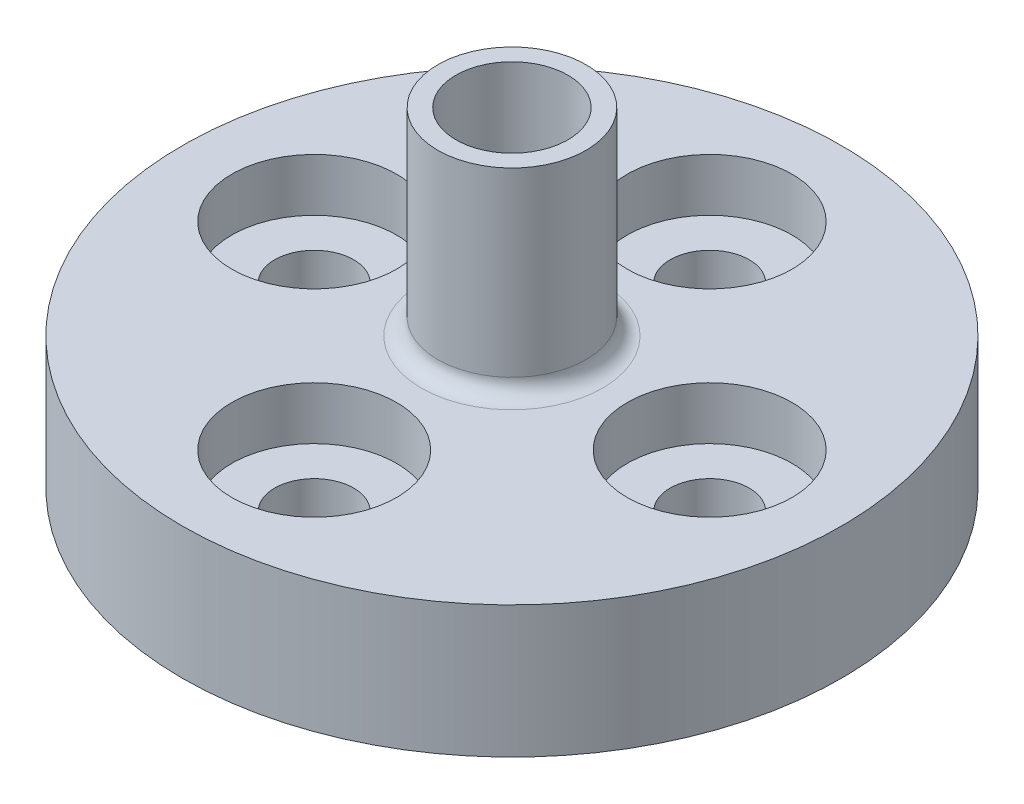
ISO-10303-21;
HEADER;
FILE_DESCRIPTION(('STEP AP214'),'2;1');
FILE_NAME('part.step','',(''),(''),'','','');
FILE_SCHEMA(('AUTOMOTIVE_DESIGN { 1 0 10303 214 1 1 1 1 }'));
ENDSEC;
DATA;
#1=APPLICATION_CONTEXT('core data for automotive mechanical design processes');
#2=APPLICATION_PROTOCOL_DEFINITION('international standard','automotive_design',2000,#1);
#3=PRODUCT_CONTEXT('',#1,'mechanical');
#4=PRODUCT('Part','Part','',(#3));
#5=PRODUCT_RELATED_PRODUCT_CATEGORY('part','',(#4));
#6=PRODUCT_DEFINITION_FORMATION('','',#4);
#7=PRODUCT_DEFINITION_CONTEXT('part definition',#1,'design');
#8=PRODUCT_DEFINITION('design','',#6,#7);
#9=PRODUCT_DEFINITION_SHAPE('','',#8);
#10=(LENGTH_UNIT() NAMED_UNIT(*) SI_UNIT(.MILLI.,.METRE.));
#11=(NAMED_UNIT(*) PLANE_ANGLE_UNIT() SI_UNIT($,.RADIAN.));
#12=(NAMED_UNIT(*) SI_UNIT($,.STERADIAN.) SOLID_ANGLE_UNIT());
#13=UNCERTAINTY_MEASURE_WITH_UNIT(LENGTH_MEASURE(1.E-05),#10,'distance_accuracy_value','');
#14=(GEOMETRIC_REPRESENTATION_CONTEXT(3) GLOBAL_UNCERTAINTY_ASSIGNED_CONTEXT((#13)) GLOBAL_UNIT_ASSIGNED_CONTEXT((#10,
#11,#12)) REPRESENTATION_CONTEXT('',''));
#15=CARTESIAN_POINT('',(0.,0.,0.));
#16=DIRECTION('',(0.,0.,1.));
#17=DIRECTION('',(1.,0.,0.));
#18=AXIS2_PLACEMENT_3D('',#15,#16,#17);
#19=CARTESIAN_POINT('',(0.,10.,0.));
#20=DIRECTION('',(0.,1.,0.));
#21=DIRECTION('',(0.,0.,1.));
#22=AXIS2_PLACEMENT_3D('',#19,#20,#21);
#23=PLANE('',#22);
#24=CARTESIAN_POINT('',(0.,10.,0.));
#25=DIRECTION('',(0.,1.,0.));
#26=DIRECTION('',(0.,0.,1.));
#27=AXIS2_PLACEMENT_3D('',#24,#25,#26);
#28=CIRCLE('',#27,2.25);
#29=CARTESIAN_POINT('',(0.,10.,2.25));
#30=VERTEX_POINT('',#29);
#31=EDGE_CURVE('E83',#30,#30,#28,.T.);
#32=ORIENTED_EDGE('',*,*,#31,.T.);
#33=EDGE_LOOP('',(#32));
#34=FACE_BOUND('',#33,.T.);
#35=CARTESIAN_POINT('',(0.,10.,0.));
#36=DIRECTION('',(0.,-1.,0.));
#37=DIRECTION('',(0.,0.,-1.));
#38=AXIS2_PLACEMENT_3D('',#35,#36,#37);
#39=CIRCLE('',#38,1.7);
#40=CARTESIAN_POINT('',(0.,10.,-1.7));
#41=VERTEX_POINT('',#40);
#42=EDGE_CURVE('E135',#41,#41,#39,.T.);
#43=ORIENTED_EDGE('',*,*,#42,.T.);
#44=EDGE_LOOP('',(#43));
#45=FACE_BOUND('',#44,.T.);
#46=ADVANCED_FACE('F43',(#34,#45),#23,.T.);
#47=CARTESIAN_POINT('',(0.,4.,0.));
#48=DIRECTION('',(0.,-1.,0.));
#49=DIRECTION('',(0.,0.,-1.));
#50=AXIS2_PLACEMENT_3D('',#47,#48,#49);
#51=CYLINDRICAL_SURFACE('',#50,10.);
#52=CARTESIAN_POINT('',(0.,4.,0.));
#53=DIRECTION('',(0.,1.,0.));
#54=DIRECTION('',(0.,0.,1.));
#55=AXIS2_PLACEMENT_3D('',#52,#53,#54);
#56=CIRCLE('',#55,10.);
#57=CARTESIAN_POINT('',(0.,4.,10.));
#58=VERTEX_POINT('',#57);
#59=EDGE_CURVE('E56',#58,#58,#56,.T.);
#60=ORIENTED_EDGE('',*,*,#59,.F.);
#61=EDGE_LOOP('',(#60));
#62=FACE_BOUND('',#61,.T.);
#63=CARTESIAN_POINT('',(0.,0.,0.));
#64=DIRECTION('',(0.,1.,0.));
#65=DIRECTION('',(0.,0.,1.));
#66=AXIS2_PLACEMENT_3D('',#63,#64,#65);
#67=CIRCLE('',#66,10.);
#68=CARTESIAN_POINT('',(0.,0.,10.));
#69=VERTEX_POINT('',#68);
#70=EDGE_CURVE('E61',#69,#69,#67,.T.);
#71=ORIENTED_EDGE('',*,*,#70,.T.);
#72=EDGE_LOOP('',(#71));
#73=FACE_BOUND('',#72,.T.);
#74=ADVANCED_FACE('F166',(#62,#73),#51,.T.);
#75=CARTESIAN_POINT('',(0.,4.,0.));
#76=DIRECTION('',(0.,1.,0.));
#77=DIRECTION('',(0.,0.,1.));
#78=AXIS2_PLACEMENT_3D('',#75,#76,#77);
#79=PLANE('',#78);
#80=CARTESIAN_POINT('',(0.,4.,0.));
#81=DIRECTION('',(0.,1.,0.));
#82=DIRECTION('',(0.,0.,1.));
#83=AXIS2_PLACEMENT_3D('',#80,#81,#82);
#84=CIRCLE('',#83,2.75);
#85=CARTESIAN_POINT('',(0.,4.,2.75));
#86=VERTEX_POINT('',#85);
#87=EDGE_CURVE('E10',#86,#86,#84,.F.);
#88=ORIENTED_EDGE('',*,*,#87,.T.);
#89=EDGE_LOOP('',(#88));
#90=FACE_BOUND('',#89,.T.);
#91=CARTESIAN_POINT('',(0.,4.,6.));
#92=DIRECTION('',(0.,1.,0.));
#93=DIRECTION('',(0.,0.,1.));
#94=AXIS2_PLACEMENT_3D('',#91,#92,#93);
#95=CIRCLE('',#94,2.5);
#96=CARTESIAN_POINT('',(0.,4.,8.5));
#97=VERTEX_POINT('',#96);
#98=EDGE_CURVE('E131',#97,#97,#95,.T.);
#99=ORIENTED_EDGE('',*,*,#98,.F.);
#100=EDGE_LOOP('',(#99));
#101=FACE_BOUND('',#100,.T.);
#102=CARTESIAN_POINT('',(-6.,4.,0.));
#103=DIRECTION('',(0.,1.,0.));
#104=DIRECTION('',(0.,0.,1.));
#105=AXIS2_PLACEMENT_3D('',#102,#103,#104);
#106=CIRCLE('',#105,2.5);
#107=CARTESIAN_POINT('',(-6.,4.,2.5));
#108=VERTEX_POINT('',#107);
#109=EDGE_CURVE('E115',#108,#108,#106,.T.);
#110=ORIENTED_EDGE('',*,*,#109,.F.);
#111=EDGE_LOOP('',(#110));
#112=FACE_BOUND('',#111,.T.);
#113=CARTESIAN_POINT('',(0.,4.,-6.));
#114=DIRECTION('',(0.,1.,0.));
#115=DIRECTION('',(0.,0.,1.));
#116=AXIS2_PLACEMENT_3D('',#113,#114,#115);
#117=CIRCLE('',#116,2.5);
#118=CARTESIAN_POINT('',(0.,4.,-3.5));
#119=VERTEX_POINT('',#118);
#120=EDGE_CURVE('E99',#119,#119,#117,.T.);
#121=ORIENTED_EDGE('',*,*,#120,.F.);
#122=EDGE_LOOP('',(#121));
#123=FACE_BOUND('',#122,.T.);
#124=CARTESIAN_POINT('',(6.,4.,0.));
#125=DIRECTION('',(0.,1.,0.));
#126=DIRECTION('',(0.,0.,1.));
#127=AXIS2_PLACEMENT_3D('',#124,#125,#126);
#128=CIRCLE('',#127,2.5);
#129=CARTESIAN_POINT('',(6.,4.,2.5));
#130=VERTEX_POINT('',#129);
#131=EDGE_CURVE('E79',#130,#130,#128,.T.);
#132=ORIENTED_EDGE('',*,*,#131,.F.);
#133=EDGE_LOOP('',(#132));
#134=FACE_BOUND('',#133,.T.);
#135=ORIENTED_EDGE('',*,*,#59,.T.);
#136=EDGE_LOOP('',(#135));
#137=FACE_BOUND('',#136,.T.);
#138=ADVANCED_FACE('F154',(#90,#101,#112,#123,#134,#137),#79,.T.);
#139=CARTESIAN_POINT('',(0.,0.,0.));
#140=DIRECTION('',(0.,1.,0.));
#141=DIRECTION('',(0.,0.,1.));
#142=AXIS2_PLACEMENT_3D('',#139,#140,#141);
#143=PLANE('',#142);
#144=CARTESIAN_POINT('',(0.,0.,0.));
#145=DIRECTION('',(0.,-1.,0.));
#146=DIRECTION('',(0.,0.,-1.));
#147=AXIS2_PLACEMENT_3D('',#144,#145,#146);
#148=CIRCLE('',#147,3.15);
#149=CARTESIAN_POINT('',(0.,0.,-3.15));
#150=VERTEX_POINT('',#149);
#151=EDGE_CURVE('E143',#150,#150,#148,.T.);
#152=ORIENTED_EDGE('',*,*,#151,.F.);
#153=EDGE_LOOP('',(#152));
#154=FACE_BOUND('',#153,.T.);
#155=CARTESIAN_POINT('',(0.,0.,6.));
#156=DIRECTION('',(0.,1.,0.));
#157=DIRECTION('',(0.,0.,1.));
#158=AXIS2_PLACEMENT_3D('',#155,#156,#157);
#159=CIRCLE('',#158,1.2);
#160=CARTESIAN_POINT('',(0.,0.,7.2));
#161=VERTEX_POINT('',#160);
#162=EDGE_CURVE('E119',#161,#161,#159,.T.);
#163=ORIENTED_EDGE('',*,*,#162,.T.);
#164=EDGE_LOOP('',(#163));
#165=FACE_BOUND('',#164,.T.);
#166=CARTESIAN_POINT('',(-6.,0.,0.));
#167=DIRECTION('',(0.,1.,0.));
#168=DIRECTION('',(0.,0.,1.));
#169=AXIS2_PLACEMENT_3D('',#166,#167,#168);
#170=CIRCLE('',#169,1.2);
#171=CARTESIAN_POINT('',(-6.,0.,1.2));
#172=VERTEX_POINT('',#171);
#173=EDGE_CURVE('E103',#172,#172,#170,.T.);
#174=ORIENTED_EDGE('',*,*,#173,.T.);
#175=EDGE_LOOP('',(#174));
#176=FACE_BOUND('',#175,.T.);
#177=CARTESIAN_POINT('',(0.,0.,-6.));
#178=DIRECTION('',(0.,1.,0.));
#179=DIRECTION('',(0.,0.,1.));
#180=AXIS2_PLACEMENT_3D('',#177,#178,#179);
#181=CIRCLE('',#180,1.2);
#182=CARTESIAN_POINT('',(0.,0.,-4.8));
#183=VERTEX_POINT('',#182);
#184=EDGE_CURVE('E87',#183,#183,#181,.T.);
#185=ORIENTED_EDGE('',*,*,#184,.T.);
#186=EDGE_LOOP('',(#185));
#187=FACE_BOUND('',#186,.T.);
#188=CARTESIAN_POINT('',(6.,0.,0.));
#189=DIRECTION('',(0.,1.,0.));
#190=DIRECTION('',(0.,0.,1.));
#191=AXIS2_PLACEMENT_3D('',#188,#189,#190);
#192=CIRCLE('',#191,1.2);
#193=CARTESIAN_POINT('',(6.,0.,1.2));
#194=VERTEX_POINT('',#193);
#195=EDGE_CURVE('E66',#194,#194,#192,.T.);
#196=ORIENTED_EDGE('',*,*,#195,.T.);
#197=EDGE_LOOP('',(#196));
#198=FACE_BOUND('',#197,.T.);
#199=ORIENTED_EDGE('',*,*,#70,.F.);
#200=EDGE_LOOP('',(#199));
#201=FACE_BOUND('',#200,.T.);
#202=ADVANCED_FACE('F150',(#154,#165,#176,#187,#198,#201),#143,.F.);
#203=CARTESIAN_POINT('',(6.,4.,0.));
#204=DIRECTION('',(0.,1.,0.));
#205=DIRECTION('',(0.,0.,1.));
#206=AXIS2_PLACEMENT_3D('',#203,#204,#205);
#207=CYLINDRICAL_SURFACE('',#206,1.2);
#208=ORIENTED_EDGE('',*,*,#195,.F.);
#209=EDGE_LOOP('',(#208));
#210=FACE_BOUND('',#209,.T.);
#211=CARTESIAN_POINT('',(6.,2.4,0.));
#212=DIRECTION('',(0.,1.,0.));
#213=DIRECTION('',(0.,0.,1.));
#214=AXIS2_PLACEMENT_3D('',#211,#212,#213);
#215=CIRCLE('',#214,1.2);
#216=CARTESIAN_POINT('',(6.,2.4,1.2));
#217=VERTEX_POINT('',#216);
#218=EDGE_CURVE('E71',#217,#217,#215,.T.);
#219=ORIENTED_EDGE('',*,*,#218,.T.);
#220=EDGE_LOOP('',(#219));
#221=FACE_BOUND('',#220,.T.);
#222=ADVANCED_FACE('F153',(#210,#221),#207,.F.);
#223=CARTESIAN_POINT('',(7.2,2.4,0.));
#224=DIRECTION('',(0.,-1.,0.));
#225=DIRECTION('',(0.,0.,-1.));
#226=AXIS2_PLACEMENT_3D('',#223,#224,#225);
#227=PLANE('',#226);
#228=ORIENTED_EDGE('',*,*,#218,.F.);
#229=EDGE_LOOP('',(#228));
#230=FACE_BOUND('',#229,.T.);
#231=CARTESIAN_POINT('',(6.,2.4,0.));
#232=DIRECTION('',(0.,1.,0.));
#233=DIRECTION('',(0.,0.,1.));
#234=AXIS2_PLACEMENT_3D('',#231,#232,#233);
#235=CIRCLE('',#234,2.5);
#236=CARTESIAN_POINT('',(6.,2.4,2.5));
#237=VERTEX_POINT('',#236);
#238=EDGE_CURVE('E75',#237,#237,#235,.T.);
#239=ORIENTED_EDGE('',*,*,#238,.T.);
#240=EDGE_LOOP('',(#239));
#241=FACE_BOUND('',#240,.T.);
#242=ADVANCED_FACE('F180',(#230,#241),#227,.F.);
#243=CARTESIAN_POINT('',(6.,4.,0.));
#244=DIRECTION('',(0.,1.,0.));
#245=DIRECTION('',(0.,0.,1.));
#246=AXIS2_PLACEMENT_3D('',#243,#244,#245);
#247=CYLINDRICAL_SURFACE('',#246,2.5);
#248=ORIENTED_EDGE('',*,*,#238,.F.);
#249=EDGE_LOOP('',(#248));
#250=FACE_BOUND('',#249,.T.);
#251=ORIENTED_EDGE('',*,*,#131,.T.);
#252=EDGE_LOOP('',(#251));
#253=FACE_BOUND('',#252,.T.);
#254=ADVANCED_FACE('F184',(#250,#253),#247,.F.);
#255=CARTESIAN_POINT('',(0.,10.,0.));
#256=DIRECTION('',(0.,-1.,0.));
#257=DIRECTION('',(0.,0.,-1.));
#258=AXIS2_PLACEMENT_3D('',#255,#256,#257);
#259=CYLINDRICAL_SURFACE('',#258,2.25);
#260=CARTESIAN_POINT('',(0.,4.5,0.));
#261=DIRECTION('',(0.,1.,0.));
#262=DIRECTION('',(0.,0.,1.));
#263=AXIS2_PLACEMENT_3D('',#260,#261,#262);
#264=CIRCLE('',#263,2.25);
#265=CARTESIAN_POINT('',(0.,4.5,2.25));
#266=VERTEX_POINT('',#265);
#267=EDGE_CURVE('E51',#266,#266,#264,.T.);
#268=ORIENTED_EDGE('',*,*,#267,.T.);
#269=EDGE_LOOP('',(#268));
#270=FACE_BOUND('',#269,.T.);
#271=ORIENTED_EDGE('',*,*,#31,.F.);
#272=EDGE_LOOP('',(#271));
#273=FACE_BOUND('',#272,.T.);
#274=ADVANCED_FACE('F188',(#270,#273),#259,.T.);
#275=CARTESIAN_POINT('',(0.,4.,-6.));
#276=DIRECTION('',(0.,1.,0.));
#277=DIRECTION('',(0.,0.,1.));
#278=AXIS2_PLACEMENT_3D('',#275,#276,#277);
#279=CYLINDRICAL_SURFACE('',#278,1.2);
#280=ORIENTED_EDGE('',*,*,#184,.F.);
#281=EDGE_LOOP('',(#280));
#282=FACE_BOUND('',#281,.T.);
#283=CARTESIAN_POINT('',(0.,2.4,-6.));
#284=DIRECTION('',(0.,1.,0.));
#285=DIRECTION('',(0.,0.,1.));
#286=AXIS2_PLACEMENT_3D('',#283,#284,#285);
#287=CIRCLE('',#286,1.2);
#288=CARTESIAN_POINT('',(0.,2.4,-4.8));
#289=VERTEX_POINT('',#288);
#290=EDGE_CURVE('E91',#289,#289,#287,.T.);
#291=ORIENTED_EDGE('',*,*,#290,.T.);
#292=EDGE_LOOP('',(#291));
#293=FACE_BOUND('',#292,.T.);
#294=ADVANCED_FACE('F191',(#282,#293),#279,.F.);
#295=CARTESIAN_POINT('',(1.19999999999998,2.4,-6.));
#296=DIRECTION('',(0.,-1.,0.));
#297=DIRECTION('',(0.,0.,-1.));
#298=AXIS2_PLACEMENT_3D('',#295,#296,#297);
#299=PLANE('',#298);
#300=ORIENTED_EDGE('',*,*,#290,.F.);
#301=EDGE_LOOP('',(#300));
#302=FACE_BOUND('',#301,.T.);
#303=CARTESIAN_POINT('',(0.,2.4,-6.));
#304=DIRECTION('',(0.,1.,0.));
#305=DIRECTION('',(0.,0.,1.));
#306=AXIS2_PLACEMENT_3D('',#303,#304,#305);
#307=CIRCLE('',#306,2.5);
#308=CARTESIAN_POINT('',(0.,2.4,-3.5));
#309=VERTEX_POINT('',#308);
#310=EDGE_CURVE('E95',#309,#309,#307,.T.);
#311=ORIENTED_EDGE('',*,*,#310,.T.);
#312=EDGE_LOOP('',(#311));
#313=FACE_BOUND('',#312,.T.);
#314=ADVANCED_FACE('F195',(#302,#313),#299,.F.);
#315=CARTESIAN_POINT('',(0.,4.,-6.));
#316=DIRECTION('',(0.,1.,0.));
#317=DIRECTION('',(0.,0.,1.));
#318=AXIS2_PLACEMENT_3D('',#315,#316,#317);
#319=CYLINDRICAL_SURFACE('',#318,2.5);
#320=ORIENTED_EDGE('',*,*,#310,.F.);
#321=EDGE_LOOP('',(#320));
#322=FACE_BOUND('',#321,.T.);
#323=ORIENTED_EDGE('',*,*,#120,.T.);
#324=EDGE_LOOP('',(#323));
#325=FACE_BOUND('',#324,.T.);
#326=ADVANCED_FACE('F199',(#322,#325),#319,.F.);
#327=CARTESIAN_POINT('',(-6.,4.,0.));
#328=DIRECTION('',(0.,1.,0.));
#329=DIRECTION('',(0.,0.,1.));
#330=AXIS2_PLACEMENT_3D('',#327,#328,#329);
#331=CYLINDRICAL_SURFACE('',#330,1.2);
#332=ORIENTED_EDGE('',*,*,#173,.F.);
#333=EDGE_LOOP('',(#332));
#334=FACE_BOUND('',#333,.T.);
#335=CARTESIAN_POINT('',(-6.,2.4,0.));
#336=DIRECTION('',(0.,1.,0.));
#337=DIRECTION('',(0.,0.,1.));
#338=AXIS2_PLACEMENT_3D('',#335,#336,#337);
#339=CIRCLE('',#338,1.2);
#340=CARTESIAN_POINT('',(-6.,2.4,1.2));
#341=VERTEX_POINT('',#340);
#342=EDGE_CURVE('E107',#341,#341,#339,.T.);
#343=ORIENTED_EDGE('',*,*,#342,.T.);
#344=EDGE_LOOP('',(#343));
#345=FACE_BOUND('',#344,.T.);
#346=ADVANCED_FACE('F203',(#334,#345),#331,.F.);
#347=CARTESIAN_POINT('',(-4.8,2.4,0.));
#348=DIRECTION('',(0.,-1.,0.));
#349=DIRECTION('',(0.,0.,-1.));
#350=AXIS2_PLACEMENT_3D('',#347,#348,#349);
#351=PLANE('',#350);
#352=ORIENTED_EDGE('',*,*,#342,.F.);
#353=EDGE_LOOP('',(#352));
#354=FACE_BOUND('',#353,.T.);
#355=CARTESIAN_POINT('',(-6.,2.4,0.));
#356=DIRECTION('',(0.,1.,0.));
#357=DIRECTION('',(0.,0.,1.));
#358=AXIS2_PLACEMENT_3D('',#355,#356,#357);
#359=CIRCLE('',#358,2.5);
#360=CARTESIAN_POINT('',(-6.,2.4,2.5));
#361=VERTEX_POINT('',#360);
#362=EDGE_CURVE('E111',#361,#361,#359,.T.);
#363=ORIENTED_EDGE('',*,*,#362,.T.);
#364=EDGE_LOOP('',(#363));
#365=FACE_BOUND('',#364,.T.);
#366=ADVANCED_FACE('F207',(#354,#365),#351,.F.);
#367=CARTESIAN_POINT('',(-6.,4.,0.));
#368=DIRECTION('',(0.,1.,0.));
#369=DIRECTION('',(0.,0.,1.));
#370=AXIS2_PLACEMENT_3D('',#367,#368,#369);
#371=CYLINDRICAL_SURFACE('',#370,2.5);
#372=ORIENTED_EDGE('',*,*,#362,.F.);
#373=EDGE_LOOP('',(#372));
#374=FACE_BOUND('',#373,.T.);
#375=ORIENTED_EDGE('',*,*,#109,.T.);
#376=EDGE_LOOP('',(#375));
#377=FACE_BOUND('',#376,.T.);
#378=ADVANCED_FACE('F211',(#374,#377),#371,.F.);
#379=CARTESIAN_POINT('',(0.,4.,6.));
#380=DIRECTION('',(0.,1.,0.));
#381=DIRECTION('',(0.,0.,1.));
#382=AXIS2_PLACEMENT_3D('',#379,#380,#381);
#383=CYLINDRICAL_SURFACE('',#382,1.2);
#384=ORIENTED_EDGE('',*,*,#162,.F.);
#385=EDGE_LOOP('',(#384));
#386=FACE_BOUND('',#385,.T.);
#387=CARTESIAN_POINT('',(0.,2.4,6.));
#388=DIRECTION('',(0.,1.,0.));
#389=DIRECTION('',(0.,0.,1.));
#390=AXIS2_PLACEMENT_3D('',#387,#388,#389);
#391=CIRCLE('',#390,1.2);
#392=CARTESIAN_POINT('',(0.,2.4,7.2));
#393=VERTEX_POINT('',#392);
#394=EDGE_CURVE('E123',#393,#393,#391,.T.);
#395=ORIENTED_EDGE('',*,*,#394,.T.);
#396=EDGE_LOOP('',(#395));
#397=FACE_BOUND('',#396,.T.);
#398=ADVANCED_FACE('F215',(#386,#397),#383,.F.);
#399=CARTESIAN_POINT('',(1.20000000000006,2.4,6.));
#400=DIRECTION('',(0.,-1.,0.));
#401=DIRECTION('',(0.,0.,-1.));
#402=AXIS2_PLACEMENT_3D('',#399,#400,#401);
#403=PLANE('',#402);
#404=ORIENTED_EDGE('',*,*,#394,.F.);
#405=EDGE_LOOP('',(#404));
#406=FACE_BOUND('',#405,.T.);
#407=CARTESIAN_POINT('',(0.,2.4,6.));
#408=DIRECTION('',(0.,1.,0.));
#409=DIRECTION('',(0.,0.,1.));
#410=AXIS2_PLACEMENT_3D('',#407,#408,#409);
#411=CIRCLE('',#410,2.5);
#412=CARTESIAN_POINT('',(0.,2.4,8.5));
#413=VERTEX_POINT('',#412);
#414=EDGE_CURVE('E127',#413,#413,#411,.T.);
#415=ORIENTED_EDGE('',*,*,#414,.T.);
#416=EDGE_LOOP('',(#415));
#417=FACE_BOUND('',#416,.T.);
#418=ADVANCED_FACE('F219',(#406,#417),#403,.F.);
#419=CARTESIAN_POINT('',(0.,4.,6.));
#420=DIRECTION('',(0.,1.,0.));
#421=DIRECTION('',(0.,0.,1.));
#422=AXIS2_PLACEMENT_3D('',#419,#420,#421);
#423=CYLINDRICAL_SURFACE('',#422,2.5);
#424=ORIENTED_EDGE('',*,*,#414,.F.);
#425=EDGE_LOOP('',(#424));
#426=FACE_BOUND('',#425,.T.);
#427=ORIENTED_EDGE('',*,*,#98,.T.);
#428=EDGE_LOOP('',(#427));
#429=FACE_BOUND('',#428,.T.);
#430=ADVANCED_FACE('F223',(#426,#429),#423,.F.);
#431=CARTESIAN_POINT('',(0.,0.,0.));
#432=DIRECTION('',(0.,-1.,0.));
#433=DIRECTION('',(0.,0.,-1.));
#434=AXIS2_PLACEMENT_3D('',#431,#432,#433);
#435=CYLINDRICAL_SURFACE('',#434,1.7);
#436=ORIENTED_EDGE('',*,*,#42,.F.);
#437=EDGE_LOOP('',(#436));
#438=FACE_BOUND('',#437,.T.);
#439=CARTESIAN_POINT('',(0.,1.45,0.));
#440=DIRECTION('',(0.,-1.,0.));
#441=DIRECTION('',(0.,0.,-1.));
#442=AXIS2_PLACEMENT_3D('',#439,#440,#441);
#443=CIRCLE('',#442,1.7);
#444=CARTESIAN_POINT('',(0.,1.45,-1.7));
#445=VERTEX_POINT('',#444);
#446=EDGE_CURVE('E139',#445,#445,#443,.T.);
#447=ORIENTED_EDGE('',*,*,#446,.T.);
#448=EDGE_LOOP('',(#447));
#449=FACE_BOUND('',#448,.T.);
#450=ADVANCED_FACE('F227',(#438,#449),#435,.F.);
#451=CARTESIAN_POINT('',(0.,0.,0.));
#452=DIRECTION('',(0.,-1.,0.));
#453=DIRECTION('',(0.,0.,-1.));
#454=AXIS2_PLACEMENT_3D('',#451,#452,#453);
#455=CONICAL_SURFACE('',#454,3.15,0.785398163397449);
#456=ORIENTED_EDGE('',*,*,#446,.F.);
#457=EDGE_LOOP('',(#456));
#458=FACE_BOUND('',#457,.T.);
#459=ORIENTED_EDGE('',*,*,#151,.T.);
#460=EDGE_LOOP('',(#459));
#461=FACE_BOUND('',#460,.T.);
#462=ADVANCED_FACE('F148',(#458,#461),#455,.F.);
#463=CARTESIAN_POINT('',(0.,4.5,0.));
#464=DIRECTION('',(0.,1.,0.));
#465=DIRECTION('',(0.,0.,1.));
#466=AXIS2_PLACEMENT_3D('',#463,#464,#465);
#467=TOROIDAL_SURFACE('',#466,2.75,0.5);
#468=ORIENTED_EDGE('',*,*,#87,.F.);
#469=EDGE_LOOP('',(#468));
#470=FACE_BOUND('',#469,.T.);
#471=ORIENTED_EDGE('',*,*,#267,.F.);
#472=EDGE_LOOP('',(#471));
#473=FACE_BOUND('',#472,.T.);
#474=ADVANCED_FACE('F45',(#470,#473),#467,.F.);
#475=CLOSED_SHELL('',(#46,#74,#138,#202,#222,#242,#254,#274,#294,#314,#326,#346,#366,#378,#398,
#418,#430,#450,#462,#474));
#476=MANIFOLD_SOLID_BREP('B2',#475);
#477=ADVANCED_BREP_SHAPE_REPRESENTATION('',(#18,#476),#14);
#478=SHAPE_DEFINITION_REPRESENTATION(#9,#477);
ENDSEC;
END-ISO-10303-21;
